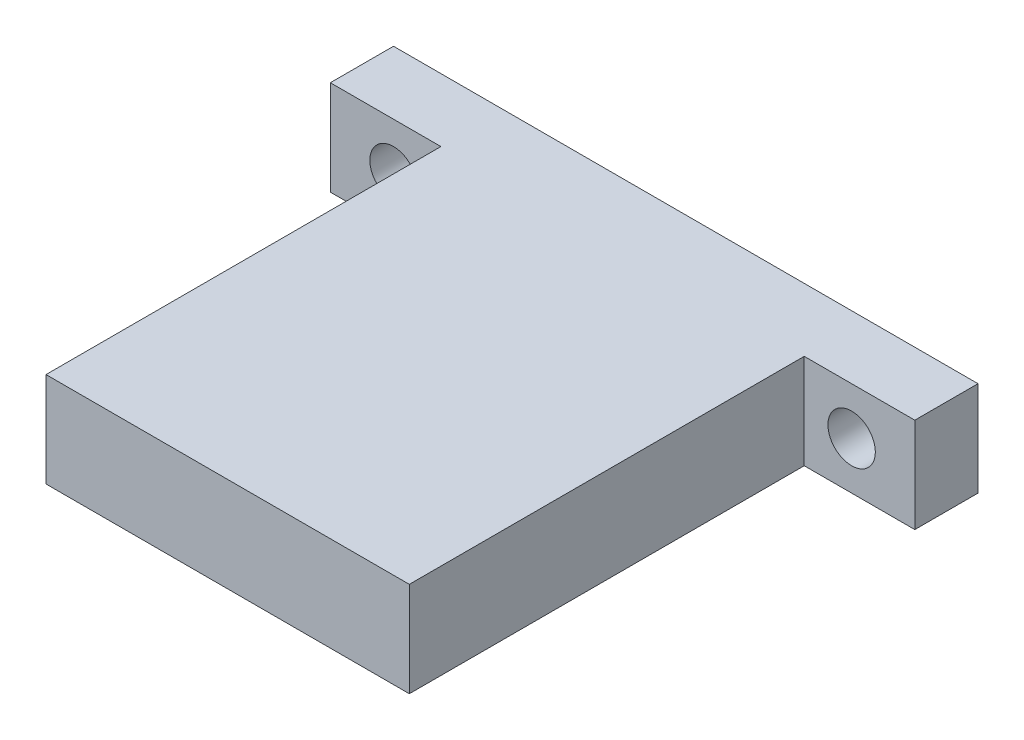
ISO-10303-21;
HEADER;
FILE_DESCRIPTION(('STEP AP214'),'2;1');
FILE_NAME('part.step','',(''),(''),'','','');
FILE_SCHEMA(('AUTOMOTIVE_DESIGN { 1 0 10303 214 1 1 1 1 }'));
ENDSEC;
DATA;
#1=APPLICATION_CONTEXT('core data for automotive mechanical design processes');
#2=APPLICATION_PROTOCOL_DEFINITION('international standard','automotive_design',2000,#1);
#3=PRODUCT_CONTEXT('',#1,'mechanical');
#4=PRODUCT('Part','Part','',(#3));
#5=PRODUCT_RELATED_PRODUCT_CATEGORY('part','',(#4));
#6=PRODUCT_DEFINITION_FORMATION('','',#4);
#7=PRODUCT_DEFINITION_CONTEXT('part definition',#1,'design');
#8=PRODUCT_DEFINITION('design','',#6,#7);
#9=PRODUCT_DEFINITION_SHAPE('','',#8);
#10=(LENGTH_UNIT() NAMED_UNIT(*) SI_UNIT(.MILLI.,.METRE.));
#11=(NAMED_UNIT(*) PLANE_ANGLE_UNIT() SI_UNIT($,.RADIAN.));
#12=(NAMED_UNIT(*) SI_UNIT($,.STERADIAN.) SOLID_ANGLE_UNIT());
#13=UNCERTAINTY_MEASURE_WITH_UNIT(LENGTH_MEASURE(1.E-05),#10,'distance_accuracy_value','');
#14=(GEOMETRIC_REPRESENTATION_CONTEXT(3) GLOBAL_UNCERTAINTY_ASSIGNED_CONTEXT((#13)) GLOBAL_UNIT_ASSIGNED_CONTEXT((#10,
#11,#12)) REPRESENTATION_CONTEXT('',''));
#15=CARTESIAN_POINT('',(0.,0.,0.));
#16=DIRECTION('',(0.,0.,1.));
#17=DIRECTION('',(1.,0.,0.));
#18=AXIS2_PLACEMENT_3D('',#15,#16,#17);
#19=CARTESIAN_POINT('',(0.,0.,4.));
#20=DIRECTION('',(0.,0.,-1.));
#21=DIRECTION('',(-1.,0.,0.));
#22=AXIS2_PLACEMENT_3D('',#19,#20,#21);
#23=PLANE('',#22);
#24=CARTESIAN_POINT('',(-33.3457943925233,9.40186915887851,4.));
#25=DIRECTION('',(0.,0.,1.));
#26=DIRECTION('',(1.,0.,0.));
#27=AXIS2_PLACEMENT_3D('',#24,#25,#26);
#28=CIRCLE('',#27,1.5);
#29=CARTESIAN_POINT('',(-31.8457943925233,9.40186915887851,4.));
#30=VERTEX_POINT('',#29);
#31=EDGE_CURVE('E310',#30,#30,#28,.T.);
#32=ORIENTED_EDGE('',*,*,#31,.F.);
#33=EDGE_LOOP('',(#32));
#34=FACE_BOUND('',#33,.T.);
#35=DIRECTION('',(0.,-1.,0.));
#36=VECTOR('',#35,1.);
#37=CARTESIAN_POINT('',(-30.3457943925233,12.4018691588785,4.));
#38=LINE('',#37,#36);
#39=CARTESIAN_POINT('',(-30.3457943925233,12.4018691588785,4.));
#40=VERTEX_POINT('',#39);
#41=CARTESIAN_POINT('',(-30.3457943925233,6.40186915887851,4.));
#42=VERTEX_POINT('',#41);
#43=EDGE_CURVE('E50',#40,#42,#38,.T.);
#44=ORIENTED_EDGE('',*,*,#43,.F.);
#45=DIRECTION('',(-1.,0.,0.));
#46=VECTOR('',#45,1.);
#47=CARTESIAN_POINT('',(-37.3457943925234,12.4018691588785,4.));
#48=LINE('',#47,#46);
#49=CARTESIAN_POINT('',(-37.3457943925234,12.4018691588785,4.));
#50=VERTEX_POINT('',#49);
#51=EDGE_CURVE('E145',#40,#50,#48,.T.);
#52=ORIENTED_EDGE('',*,*,#51,.T.);
#53=DIRECTION('',(0.,-1.,0.));
#54=VECTOR('',#53,1.);
#55=CARTESIAN_POINT('',(-37.3457943925234,6.40186915887851,4.));
#56=LINE('',#55,#54);
#57=CARTESIAN_POINT('',(-37.3457943925234,6.40186915887851,4.));
#58=VERTEX_POINT('',#57);
#59=EDGE_CURVE('E177',#50,#58,#56,.T.);
#60=ORIENTED_EDGE('',*,*,#59,.T.);
#61=DIRECTION('',(1.,0.,0.));
#62=VECTOR('',#61,1.);
#63=CARTESIAN_POINT('',(-37.3457943925234,6.40186915887851,4.));
#64=LINE('',#63,#62);
#65=EDGE_CURVE('E164',#58,#42,#64,.T.);
#66=ORIENTED_EDGE('',*,*,#65,.T.);
#67=EDGE_LOOP('',(#44,#52,#60,#66));
#68=FACE_BOUND('',#67,.T.);
#69=ADVANCED_FACE('F33',(#34,#68),#23,.F.);
#70=CARTESIAN_POINT('',(-4.34579439252334,9.40186915887851,4.));
#71=DIRECTION('',(0.,0.,1.));
#72=DIRECTION('',(1.,0.,0.));
#73=AXIS2_PLACEMENT_3D('',#70,#71,#72);
#74=CIRCLE('',#73,1.5);
#75=CARTESIAN_POINT('',(-2.84579439252334,9.40186915887851,4.));
#76=VERTEX_POINT('',#75);
#77=EDGE_CURVE('E308',#76,#76,#74,.T.);
#78=ORIENTED_EDGE('',*,*,#77,.F.);
#79=EDGE_LOOP('',(#78));
#80=FACE_BOUND('',#79,.T.);
#81=DIRECTION('',(0.,1.,0.));
#82=VECTOR('',#81,1.);
#83=CARTESIAN_POINT('',(-7.34579439252334,12.4018691588785,4.));
#84=LINE('',#83,#82);
#85=CARTESIAN_POINT('',(-7.34579439252334,6.40186915887851,4.));
#86=VERTEX_POINT('',#85);
#87=CARTESIAN_POINT('',(-7.34579439252334,12.4018691588785,4.));
#88=VERTEX_POINT('',#87);
#89=EDGE_CURVE('E58',#86,#88,#84,.T.);
#90=ORIENTED_EDGE('',*,*,#89,.F.);
#91=CARTESIAN_POINT('',(-0.345794392523351,6.40186915887851,4.));
#92=VERTEX_POINT('',#91);
#93=EDGE_CURVE('E167',#86,#92,#64,.T.);
#94=ORIENTED_EDGE('',*,*,#93,.T.);
#95=DIRECTION('',(0.,1.,0.));
#96=VECTOR('',#95,1.);
#97=CARTESIAN_POINT('',(-0.345794392523351,6.40186915887851,4.));
#98=LINE('',#97,#96);
#99=CARTESIAN_POINT('',(-0.345794392523351,12.4018691588785,4.));
#100=VERTEX_POINT('',#99);
#101=EDGE_CURVE('E161',#92,#100,#98,.T.);
#102=ORIENTED_EDGE('',*,*,#101,.T.);
#103=EDGE_CURVE('E160',#100,#88,#48,.T.);
#104=ORIENTED_EDGE('',*,*,#103,.T.);
#105=EDGE_LOOP('',(#90,#94,#102,#104));
#106=FACE_BOUND('',#105,.T.);
#107=ADVANCED_FACE('F195',(#80,#106),#23,.F.);
#108=CARTESIAN_POINT('',(-37.3457943925234,16.4018691588785,25.));
#109=DIRECTION('',(1.,0.,0.));
#110=DIRECTION('',(0.,0.,-1.));
#111=AXIS2_PLACEMENT_3D('',#108,#109,#110);
#112=PLANE('',#111);
#113=ORIENTED_EDGE('',*,*,#59,.F.);
#114=DIRECTION('',(0.,0.,-1.));
#115=VECTOR('',#114,1.);
#116=CARTESIAN_POINT('',(-37.3457943925234,12.4018691588785,25.));
#117=LINE('',#116,#115);
#118=CARTESIAN_POINT('',(-37.3457943925234,12.4018691588785,0.));
#119=VERTEX_POINT('',#118);
#120=EDGE_CURVE('E158',#50,#119,#117,.T.);
#121=ORIENTED_EDGE('',*,*,#120,.T.);
#122=DIRECTION('',(0.,-1.,0.));
#123=VECTOR('',#122,1.);
#124=CARTESIAN_POINT('',(-37.3457943925234,16.4018691588785,0.));
#125=LINE('',#124,#123);
#126=CARTESIAN_POINT('',(-37.3457943925234,6.40186915887851,0.));
#127=VERTEX_POINT('',#126);
#128=EDGE_CURVE('E162',#119,#127,#125,.T.);
#129=ORIENTED_EDGE('',*,*,#128,.T.);
#130=DIRECTION('',(0.,0.,-1.));
#131=VECTOR('',#130,1.);
#132=CARTESIAN_POINT('',(-37.3457943925234,6.40186915887851,25.));
#133=LINE('',#132,#131);
#134=EDGE_CURVE('E11',#58,#127,#133,.T.);
#135=ORIENTED_EDGE('',*,*,#134,.F.);
#136=EDGE_LOOP('',(#113,#121,#129,#135));
#137=FACE_BOUND('',#136,.T.);
#138=ADVANCED_FACE('F35',(#137),#112,.F.);
#139=CARTESIAN_POINT('',(-37.3457943925234,6.40186915887851,25.));
#140=DIRECTION('',(0.,1.,0.));
#141=DIRECTION('',(-1.,0.,0.));
#142=AXIS2_PLACEMENT_3D('',#139,#140,#141);
#143=PLANE('',#142);
#144=DIRECTION('',(0.,0.,-1.));
#145=VECTOR('',#144,1.);
#146=CARTESIAN_POINT('',(-0.345794392523351,6.40186915887851,25.));
#147=LINE('',#146,#145);
#148=CARTESIAN_POINT('',(-0.345794392523351,6.40186915887851,0.));
#149=VERTEX_POINT('',#148);
#150=EDGE_CURVE('E42',#92,#149,#147,.T.);
#151=ORIENTED_EDGE('',*,*,#150,.F.);
#152=ORIENTED_EDGE('',*,*,#93,.F.);
#153=DIRECTION('',(0.,0.,-1.));
#154=VECTOR('',#153,1.);
#155=CARTESIAN_POINT('',(-7.34579439252334,6.40186915887851,29.));
#156=LINE('',#155,#154);
#157=CARTESIAN_POINT('',(-7.34579439252334,6.40186915887851,29.));
#158=VERTEX_POINT('',#157);
#159=EDGE_CURVE('E108',#158,#86,#156,.T.);
#160=ORIENTED_EDGE('',*,*,#159,.F.);
#161=DIRECTION('',(1.,0.,0.));
#162=VECTOR('',#161,1.);
#163=CARTESIAN_POINT('',(-30.3457943925233,6.40186915887851,29.));
#164=LINE('',#163,#162);
#165=CARTESIAN_POINT('',(-30.3457943925233,6.40186915887851,29.));
#166=VERTEX_POINT('',#165);
#167=EDGE_CURVE('E100',#166,#158,#164,.T.);
#168=ORIENTED_EDGE('',*,*,#167,.F.);
#169=DIRECTION('',(0.,0.,-1.));
#170=VECTOR('',#169,1.);
#171=CARTESIAN_POINT('',(-30.3457943925233,6.40186915887851,29.));
#172=LINE('',#171,#170);
#173=EDGE_CURVE('E106',#166,#42,#172,.T.);
#174=ORIENTED_EDGE('',*,*,#173,.T.);
#175=ORIENTED_EDGE('',*,*,#65,.F.);
#176=ORIENTED_EDGE('',*,*,#134,.T.);
#177=DIRECTION('',(1.,0.,0.));
#178=VECTOR('',#177,1.);
#179=CARTESIAN_POINT('',(-37.3457943925234,6.40186915887851,0.));
#180=LINE('',#179,#178);
#181=EDGE_CURVE('E182',#127,#149,#180,.T.);
#182=ORIENTED_EDGE('',*,*,#181,.T.);
#183=EDGE_LOOP('',(#151,#152,#160,#168,#174,#175,#176,#182));
#184=FACE_BOUND('',#183,.T.);
#185=ADVANCED_FACE('F103',(#184),#143,.F.);
#186=CARTESIAN_POINT('',(-0.345794392523351,16.4018691588785,25.));
#187=DIRECTION('',(-1.,0.,0.));
#188=DIRECTION('',(0.,0.,1.));
#189=AXIS2_PLACEMENT_3D('',#186,#187,#188);
#190=PLANE('',#189);
#191=DIRECTION('',(0.,1.,0.));
#192=VECTOR('',#191,1.);
#193=CARTESIAN_POINT('',(-0.345794392523351,16.4018691588785,0.));
#194=LINE('',#193,#192);
#195=CARTESIAN_POINT('',(-0.345794392523351,12.4018691588785,0.));
#196=VERTEX_POINT('',#195);
#197=EDGE_CURVE('E180',#149,#196,#194,.T.);
#198=ORIENTED_EDGE('',*,*,#197,.T.);
#199=DIRECTION('',(0.,0.,-1.));
#200=VECTOR('',#199,1.);
#201=CARTESIAN_POINT('',(-0.345794392523351,12.4018691588785,25.));
#202=LINE('',#201,#200);
#203=EDGE_CURVE('E125',#100,#196,#202,.T.);
#204=ORIENTED_EDGE('',*,*,#203,.F.);
#205=ORIENTED_EDGE('',*,*,#101,.F.);
#206=ORIENTED_EDGE('',*,*,#150,.T.);
#207=EDGE_LOOP('',(#198,#204,#205,#206));
#208=FACE_BOUND('',#207,.T.);
#209=ADVANCED_FACE('F194',(#208),#190,.F.);
#210=CARTESIAN_POINT('',(0.,0.,0.));
#211=DIRECTION('',(0.,0.,1.));
#212=DIRECTION('',(1.,0.,0.));
#213=AXIS2_PLACEMENT_3D('',#210,#211,#212);
#214=PLANE('',#213);
#215=CARTESIAN_POINT('',(-4.34579439252334,9.40186915887851,0.));
#216=DIRECTION('',(0.,0.,1.));
#217=DIRECTION('',(1.,0.,0.));
#218=AXIS2_PLACEMENT_3D('',#215,#216,#217);
#219=CIRCLE('',#218,1.5);
#220=CARTESIAN_POINT('',(-2.84579439252334,9.40186915887851,0.));
#221=VERTEX_POINT('',#220);
#222=EDGE_CURVE('E306',#221,#221,#219,.T.);
#223=ORIENTED_EDGE('',*,*,#222,.T.);
#224=EDGE_LOOP('',(#223));
#225=FACE_BOUND('',#224,.T.);
#226=CARTESIAN_POINT('',(-33.3457943925233,9.40186915887851,0.));
#227=DIRECTION('',(0.,0.,1.));
#228=DIRECTION('',(1.,0.,0.));
#229=AXIS2_PLACEMENT_3D('',#226,#227,#228);
#230=CIRCLE('',#229,1.5);
#231=CARTESIAN_POINT('',(-31.8457943925233,9.40186915887851,0.));
#232=VERTEX_POINT('',#231);
#233=EDGE_CURVE('E314',#232,#232,#230,.T.);
#234=ORIENTED_EDGE('',*,*,#233,.T.);
#235=EDGE_LOOP('',(#234));
#236=FACE_BOUND('',#235,.T.);
#237=ORIENTED_EDGE('',*,*,#128,.F.);
#238=DIRECTION('',(-1.,0.,0.));
#239=VECTOR('',#238,1.);
#240=CARTESIAN_POINT('',(-0.345794392523351,12.4018691588785,0.));
#241=LINE('',#240,#239);
#242=EDGE_CURVE('E123',#196,#119,#241,.T.);
#243=ORIENTED_EDGE('',*,*,#242,.F.);
#244=ORIENTED_EDGE('',*,*,#197,.F.);
#245=ORIENTED_EDGE('',*,*,#181,.F.);
#246=EDGE_LOOP('',(#237,#243,#244,#245));
#247=FACE_BOUND('',#246,.T.);
#248=ADVANCED_FACE('F191',(#225,#236,#247),#214,.F.);
#249=CARTESIAN_POINT('',(-33.3457943925233,9.40186915887851,0.));
#250=DIRECTION('',(0.,0.,1.));
#251=DIRECTION('',(1.,0.,0.));
#252=AXIS2_PLACEMENT_3D('',#249,#250,#251);
#253=CYLINDRICAL_SURFACE('',#252,1.5);
#254=ORIENTED_EDGE('',*,*,#233,.F.);
#255=EDGE_LOOP('',(#254));
#256=FACE_BOUND('',#255,.T.);
#257=ORIENTED_EDGE('',*,*,#31,.T.);
#258=EDGE_LOOP('',(#257));
#259=FACE_BOUND('',#258,.T.);
#260=ADVANCED_FACE('F207',(#256,#259),#253,.F.);
#261=CARTESIAN_POINT('',(-4.34579439252334,9.40186915887851,0.));
#262=DIRECTION('',(0.,0.,1.));
#263=DIRECTION('',(1.,0.,0.));
#264=AXIS2_PLACEMENT_3D('',#261,#262,#263);
#265=CYLINDRICAL_SURFACE('',#264,1.5);
#266=ORIENTED_EDGE('',*,*,#222,.F.);
#267=EDGE_LOOP('',(#266));
#268=FACE_BOUND('',#267,.T.);
#269=ORIENTED_EDGE('',*,*,#77,.T.);
#270=EDGE_LOOP('',(#269));
#271=FACE_BOUND('',#270,.T.);
#272=ADVANCED_FACE('F234',(#268,#271),#265,.F.);
#273=CARTESIAN_POINT('',(-0.345794392523351,12.4018691588785,25.));
#274=DIRECTION('',(0.,-1.,0.));
#275=DIRECTION('',(0.,0.,-1.));
#276=AXIS2_PLACEMENT_3D('',#273,#274,#275);
#277=PLANE('',#276);
#278=ORIENTED_EDGE('',*,*,#203,.T.);
#279=ORIENTED_EDGE('',*,*,#242,.T.);
#280=ORIENTED_EDGE('',*,*,#120,.F.);
#281=ORIENTED_EDGE('',*,*,#51,.F.);
#282=DIRECTION('',(0.,0.,-1.));
#283=VECTOR('',#282,1.);
#284=CARTESIAN_POINT('',(-30.3457943925233,12.4018691588785,29.));
#285=LINE('',#284,#283);
#286=CARTESIAN_POINT('',(-30.3457943925233,12.4018691588785,29.));
#287=VERTEX_POINT('',#286);
#288=EDGE_CURVE('E135',#287,#40,#285,.T.);
#289=ORIENTED_EDGE('',*,*,#288,.F.);
#290=DIRECTION('',(-1.,0.,0.));
#291=VECTOR('',#290,1.);
#292=CARTESIAN_POINT('',(-30.3457943925233,12.4018691588785,29.));
#293=LINE('',#292,#291);
#294=CARTESIAN_POINT('',(-7.34579439252334,12.4018691588785,29.));
#295=VERTEX_POINT('',#294);
#296=EDGE_CURVE('E117',#295,#287,#293,.T.);
#297=ORIENTED_EDGE('',*,*,#296,.F.);
#298=DIRECTION('',(0.,0.,-1.));
#299=VECTOR('',#298,1.);
#300=CARTESIAN_POINT('',(-7.34579439252334,12.4018691588785,29.));
#301=LINE('',#300,#299);
#302=EDGE_CURVE('E127',#295,#88,#301,.T.);
#303=ORIENTED_EDGE('',*,*,#302,.T.);
#304=ORIENTED_EDGE('',*,*,#103,.F.);
#305=EDGE_LOOP('',(#278,#279,#280,#281,#289,#297,#303,#304));
#306=FACE_BOUND('',#305,.T.);
#307=ADVANCED_FACE('F155',(#306),#277,.F.);
#308=CARTESIAN_POINT('',(-30.3457943925233,12.4018691588785,29.));
#309=DIRECTION('',(1.,0.,0.));
#310=DIRECTION('',(0.,0.,-1.));
#311=AXIS2_PLACEMENT_3D('',#308,#309,#310);
#312=PLANE('',#311);
#313=ORIENTED_EDGE('',*,*,#43,.T.);
#314=ORIENTED_EDGE('',*,*,#173,.F.);
#315=DIRECTION('',(0.,-1.,0.));
#316=VECTOR('',#315,1.);
#317=CARTESIAN_POINT('',(-30.3457943925233,12.4018691588785,29.));
#318=LINE('',#317,#316);
#319=EDGE_CURVE('E112',#287,#166,#318,.T.);
#320=ORIENTED_EDGE('',*,*,#319,.F.);
#321=ORIENTED_EDGE('',*,*,#288,.T.);
#322=EDGE_LOOP('',(#313,#314,#320,#321));
#323=FACE_BOUND('',#322,.T.);
#324=ADVANCED_FACE('F122',(#323),#312,.F.);
#325=CARTESIAN_POINT('',(-7.34579439252334,12.4018691588785,29.));
#326=DIRECTION('',(-1.,0.,0.));
#327=DIRECTION('',(0.,0.,1.));
#328=AXIS2_PLACEMENT_3D('',#325,#326,#327);
#329=PLANE('',#328);
#330=ORIENTED_EDGE('',*,*,#89,.T.);
#331=ORIENTED_EDGE('',*,*,#302,.F.);
#332=DIRECTION('',(0.,1.,0.));
#333=VECTOR('',#332,1.);
#334=CARTESIAN_POINT('',(-7.34579439252334,12.4018691588785,29.));
#335=LINE('',#334,#333);
#336=EDGE_CURVE('E111',#158,#295,#335,.T.);
#337=ORIENTED_EDGE('',*,*,#336,.F.);
#338=ORIENTED_EDGE('',*,*,#159,.T.);
#339=EDGE_LOOP('',(#330,#331,#337,#338));
#340=FACE_BOUND('',#339,.T.);
#341=ADVANCED_FACE('F154',(#340),#329,.F.);
#342=CARTESIAN_POINT('',(0.,0.,29.));
#343=DIRECTION('',(0.,0.,1.));
#344=DIRECTION('',(1.,0.,0.));
#345=AXIS2_PLACEMENT_3D('',#342,#343,#344);
#346=PLANE('',#345);
#347=ORIENTED_EDGE('',*,*,#319,.T.);
#348=ORIENTED_EDGE('',*,*,#167,.T.);
#349=ORIENTED_EDGE('',*,*,#336,.T.);
#350=ORIENTED_EDGE('',*,*,#296,.T.);
#351=EDGE_LOOP('',(#347,#348,#349,#350));
#352=FACE_BOUND('',#351,.T.);
#353=ADVANCED_FACE('F115',(#352),#346,.T.);
#354=CLOSED_SHELL('',(#69,#107,#138,#185,#209,#248,#260,#272,#307,#324,#341,#353));
#355=MANIFOLD_SOLID_BREP('B2',#354);
#356=ADVANCED_BREP_SHAPE_REPRESENTATION('',(#18,#355),#14);
#357=SHAPE_DEFINITION_REPRESENTATION(#9,#356);
ENDSEC;
END-ISO-10303-21;
